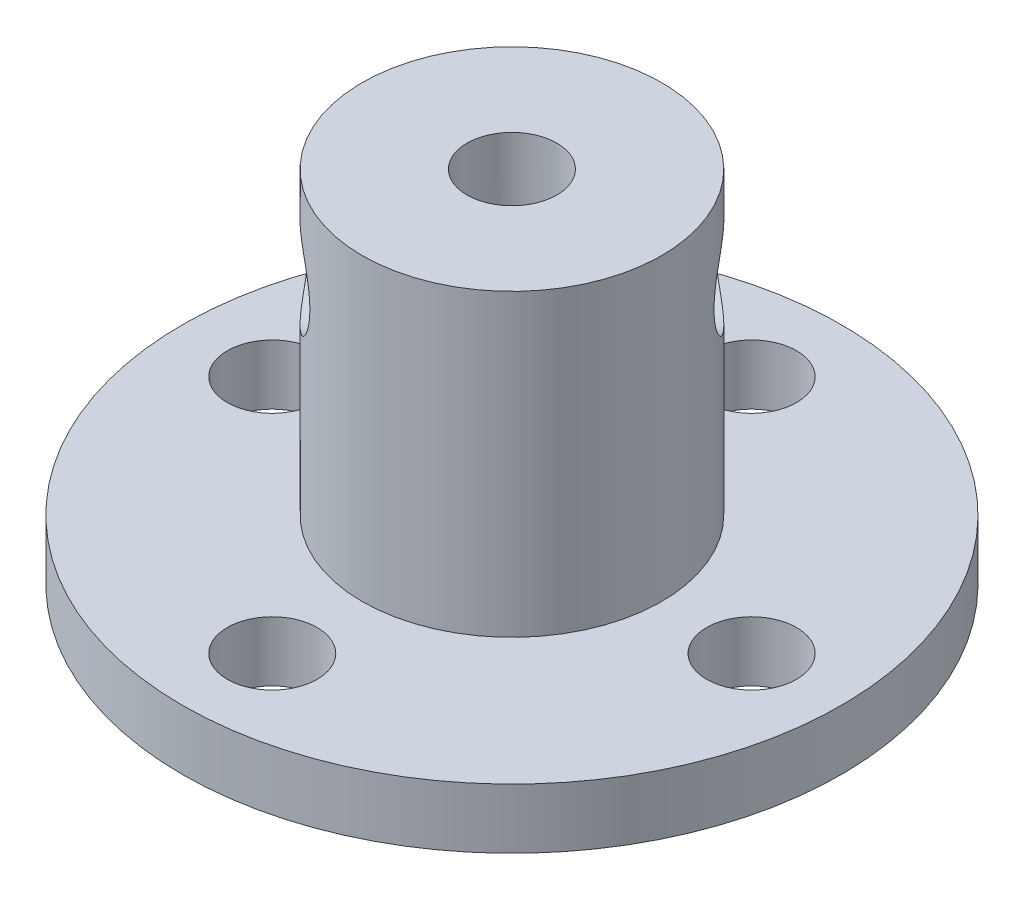
ISO-10303-21;
HEADER;
FILE_DESCRIPTION(('STEP AP214'),'2;1');
FILE_NAME('part.step','',(''),(''),'','','');
FILE_SCHEMA(('AUTOMOTIVE_DESIGN { 1 0 10303 214 1 1 1 1 }'));
ENDSEC;
DATA;
#1=APPLICATION_CONTEXT('core data for automotive mechanical design processes');
#2=APPLICATION_PROTOCOL_DEFINITION('international standard','automotive_design',2000,#1);
#3=PRODUCT_CONTEXT('',#1,'mechanical');
#4=PRODUCT('Part','Part','',(#3));
#5=PRODUCT_RELATED_PRODUCT_CATEGORY('part','',(#4));
#6=PRODUCT_DEFINITION_FORMATION('','',#4);
#7=PRODUCT_DEFINITION_CONTEXT('part definition',#1,'design');
#8=PRODUCT_DEFINITION('design','',#6,#7);
#9=PRODUCT_DEFINITION_SHAPE('','',#8);
#10=(LENGTH_UNIT() NAMED_UNIT(*) SI_UNIT(.MILLI.,.METRE.));
#11=(NAMED_UNIT(*) PLANE_ANGLE_UNIT() SI_UNIT($,.RADIAN.));
#12=(NAMED_UNIT(*) SI_UNIT($,.STERADIAN.) SOLID_ANGLE_UNIT());
#13=UNCERTAINTY_MEASURE_WITH_UNIT(LENGTH_MEASURE(1.E-05),#10,'distance_accuracy_value','');
#14=(GEOMETRIC_REPRESENTATION_CONTEXT(3) GLOBAL_UNCERTAINTY_ASSIGNED_CONTEXT((#13)) GLOBAL_UNIT_ASSIGNED_CONTEXT((#10,
#11,#12)) REPRESENTATION_CONTEXT('',''));
#15=CARTESIAN_POINT('',(0.,0.,0.));
#16=DIRECTION('',(0.,0.,1.));
#17=DIRECTION('',(1.,0.,0.));
#18=AXIS2_PLACEMENT_3D('',#15,#16,#17);
#19=CARTESIAN_POINT('',(0.,0.,0.));
#20=DIRECTION('',(0.,1.,0.));
#21=DIRECTION('',(0.,0.,1.));
#22=AXIS2_PLACEMENT_3D('',#19,#20,#21);
#23=CYLINDRICAL_SURFACE('',#22,1.5);
#24=CARTESIAN_POINT('',(0.,12.,0.));
#25=DIRECTION('',(0.,1.,0.));
#26=DIRECTION('',(0.,0.,1.));
#27=AXIS2_PLACEMENT_3D('',#24,#25,#26);
#28=CIRCLE('',#27,1.5);
#29=CARTESIAN_POINT('',(0.,12.,1.5));
#30=VERTEX_POINT('',#29);
#31=EDGE_CURVE('E108',#30,#30,#28,.T.);
#32=ORIENTED_EDGE('',*,*,#31,.T.);
#33=EDGE_LOOP('',(#32));
#34=FACE_BOUND('',#33,.T.);
#35=CARTESIAN_POINT('',(0.,9.,0.));
#36=DIRECTION('',(-0.5,0.707106781186547,0.5));
#37=DIRECTION('',(0.5,0.707106781186547,-0.5));
#38=AXIS2_PLACEMENT_3D('',#35,#36,#37);
#39=ELLIPSE('',#38,2.12132034355964,1.5);
#40=CARTESIAN_POINT('',(-1.06066017177982,9.,-1.06066017177982));
#41=VERTEX_POINT('',#40);
#42=CARTESIAN_POINT('',(1.06066017177982,9.,1.06066017177982));
#43=VERTEX_POINT('',#42);
#44=EDGE_CURVE('E52',#41,#43,#39,.F.);
#45=ORIENTED_EDGE('',*,*,#44,.T.);
#46=CARTESIAN_POINT('',(0.,9.,0.));
#47=DIRECTION('',(0.5,0.707106781186547,-0.5));
#48=DIRECTION('',(-0.5,0.707106781186547,0.5));
#49=AXIS2_PLACEMENT_3D('',#46,#47,#48);
#50=ELLIPSE('',#49,2.12132034355964,1.5);
#51=EDGE_CURVE('E11',#43,#41,#50,.F.);
#52=ORIENTED_EDGE('',*,*,#51,.T.);
#53=EDGE_LOOP('',(#45,#52));
#54=FACE_BOUND('',#53,.T.);
#55=ADVANCED_FACE('F39',(#34,#54),#23,.F.);
#56=CARTESIAN_POINT('',(0.,2.,0.));
#57=DIRECTION('',(0.,1.,0.));
#58=DIRECTION('',(0.,0.,1.));
#59=AXIS2_PLACEMENT_3D('',#56,#57,#58);
#60=PLANE('',#59);
#61=CARTESIAN_POINT('',(0.,2.,0.));
#62=DIRECTION('',(0.,1.,0.));
#63=DIRECTION('',(0.,0.,1.));
#64=AXIS2_PLACEMENT_3D('',#61,#62,#63);
#65=CIRCLE('',#64,5.);
#66=CARTESIAN_POINT('',(0.,2.,5.));
#67=VERTEX_POINT('',#66);
#68=EDGE_CURVE('E102',#67,#67,#65,.T.);
#69=ORIENTED_EDGE('',*,*,#68,.F.);
#70=EDGE_LOOP('',(#69));
#71=FACE_BOUND('',#70,.T.);
#72=CARTESIAN_POINT('',(0.,2.,8.));
#73=DIRECTION('',(0.,1.,0.));
#74=DIRECTION('',(0.,0.,1.));
#75=AXIS2_PLACEMENT_3D('',#72,#73,#74);
#76=CIRCLE('',#75,1.5);
#77=CARTESIAN_POINT('',(0.,2.,9.5));
#78=VERTEX_POINT('',#77);
#79=EDGE_CURVE('E87',#78,#78,#76,.T.);
#80=ORIENTED_EDGE('',*,*,#79,.F.);
#81=EDGE_LOOP('',(#80));
#82=FACE_BOUND('',#81,.T.);
#83=CARTESIAN_POINT('',(0.,2.,-8.));
#84=DIRECTION('',(0.,1.,0.));
#85=DIRECTION('',(0.,0.,1.));
#86=AXIS2_PLACEMENT_3D('',#83,#84,#85);
#87=CIRCLE('',#86,1.5);
#88=CARTESIAN_POINT('',(0.,2.,-6.5));
#89=VERTEX_POINT('',#88);
#90=EDGE_CURVE('E75',#89,#89,#87,.T.);
#91=ORIENTED_EDGE('',*,*,#90,.F.);
#92=EDGE_LOOP('',(#91));
#93=FACE_BOUND('',#92,.T.);
#94=CARTESIAN_POINT('',(0.,2.,0.));
#95=DIRECTION('',(0.,1.,0.));
#96=DIRECTION('',(0.,0.,1.));
#97=AXIS2_PLACEMENT_3D('',#94,#95,#96);
#98=CIRCLE('',#97,11.);
#99=CARTESIAN_POINT('',(0.,2.,11.));
#100=VERTEX_POINT('',#99);
#101=EDGE_CURVE('E67',#100,#100,#98,.T.);
#102=ORIENTED_EDGE('',*,*,#101,.T.);
#103=EDGE_LOOP('',(#102));
#104=FACE_BOUND('',#103,.T.);
#105=CARTESIAN_POINT('',(8.,2.,0.));
#106=DIRECTION('',(0.,1.,0.));
#107=DIRECTION('',(0.,0.,1.));
#108=AXIS2_PLACEMENT_3D('',#105,#106,#107);
#109=CIRCLE('',#108,1.5);
#110=CARTESIAN_POINT('',(8.,2.,1.50000000000003));
#111=VERTEX_POINT('',#110);
#112=EDGE_CURVE('E81',#111,#111,#109,.T.);
#113=ORIENTED_EDGE('',*,*,#112,.F.);
#114=EDGE_LOOP('',(#113));
#115=FACE_BOUND('',#114,.T.);
#116=CARTESIAN_POINT('',(-8.,2.,0.));
#117=DIRECTION('',(0.,1.,0.));
#118=DIRECTION('',(0.,0.,1.));
#119=AXIS2_PLACEMENT_3D('',#116,#117,#118);
#120=CIRCLE('',#119,1.5);
#121=CARTESIAN_POINT('',(-8.,2.,1.49999999999992));
#122=VERTEX_POINT('',#121);
#123=EDGE_CURVE('E93',#122,#122,#120,.T.);
#124=ORIENTED_EDGE('',*,*,#123,.F.);
#125=EDGE_LOOP('',(#124));
#126=FACE_BOUND('',#125,.T.);
#127=ADVANCED_FACE('F146',(#71,#82,#93,#104,#115,#126),#60,.T.);
#128=CARTESIAN_POINT('',(0.,0.,0.));
#129=DIRECTION('',(0.,1.,0.));
#130=DIRECTION('',(0.,0.,1.));
#131=AXIS2_PLACEMENT_3D('',#128,#129,#130);
#132=PLANE('',#131);
#133=CARTESIAN_POINT('',(0.,0.,0.));
#134=DIRECTION('',(0.,1.,0.));
#135=DIRECTION('',(0.,0.,1.));
#136=AXIS2_PLACEMENT_3D('',#133,#134,#135);
#137=CIRCLE('',#136,1.5);
#138=CARTESIAN_POINT('',(0.,0.,1.5));
#139=VERTEX_POINT('',#138);
#140=EDGE_CURVE('E105',#139,#139,#137,.T.);
#141=ORIENTED_EDGE('',*,*,#140,.T.);
#142=EDGE_LOOP('',(#141));
#143=FACE_BOUND('',#142,.T.);
#144=CARTESIAN_POINT('',(0.,0.,0.));
#145=DIRECTION('',(0.,1.,0.));
#146=DIRECTION('',(0.,0.,1.));
#147=AXIS2_PLACEMENT_3D('',#144,#145,#146);
#148=CIRCLE('',#147,11.);
#149=CARTESIAN_POINT('',(0.,0.,11.));
#150=VERTEX_POINT('',#149);
#151=EDGE_CURVE('E72',#150,#150,#148,.T.);
#152=ORIENTED_EDGE('',*,*,#151,.F.);
#153=EDGE_LOOP('',(#152));
#154=FACE_BOUND('',#153,.T.);
#155=CARTESIAN_POINT('',(0.,0.,-8.));
#156=DIRECTION('',(0.,1.,0.));
#157=DIRECTION('',(0.,0.,1.));
#158=AXIS2_PLACEMENT_3D('',#155,#156,#157);
#159=CIRCLE('',#158,1.5);
#160=CARTESIAN_POINT('',(0.,0.,-6.5));
#161=VERTEX_POINT('',#160);
#162=EDGE_CURVE('E78',#161,#161,#159,.T.);
#163=ORIENTED_EDGE('',*,*,#162,.T.);
#164=EDGE_LOOP('',(#163));
#165=FACE_BOUND('',#164,.T.);
#166=CARTESIAN_POINT('',(8.,0.,0.));
#167=DIRECTION('',(0.,1.,0.));
#168=DIRECTION('',(0.,0.,1.));
#169=AXIS2_PLACEMENT_3D('',#166,#167,#168);
#170=CIRCLE('',#169,1.5);
#171=CARTESIAN_POINT('',(8.,0.,1.50000000000003));
#172=VERTEX_POINT('',#171);
#173=EDGE_CURVE('E84',#172,#172,#170,.T.);
#174=ORIENTED_EDGE('',*,*,#173,.T.);
#175=EDGE_LOOP('',(#174));
#176=FACE_BOUND('',#175,.T.);
#177=CARTESIAN_POINT('',(0.,0.,8.));
#178=DIRECTION('',(0.,1.,0.));
#179=DIRECTION('',(0.,0.,1.));
#180=AXIS2_PLACEMENT_3D('',#177,#178,#179);
#181=CIRCLE('',#180,1.5);
#182=CARTESIAN_POINT('',(0.,0.,9.5));
#183=VERTEX_POINT('',#182);
#184=EDGE_CURVE('E90',#183,#183,#181,.T.);
#185=ORIENTED_EDGE('',*,*,#184,.T.);
#186=EDGE_LOOP('',(#185));
#187=FACE_BOUND('',#186,.T.);
#188=CARTESIAN_POINT('',(-8.,0.,0.));
#189=DIRECTION('',(0.,1.,0.));
#190=DIRECTION('',(0.,0.,1.));
#191=AXIS2_PLACEMENT_3D('',#188,#189,#190);
#192=CIRCLE('',#191,1.5);
#193=CARTESIAN_POINT('',(-8.,0.,1.49999999999992));
#194=VERTEX_POINT('',#193);
#195=EDGE_CURVE('E96',#194,#194,#192,.T.);
#196=ORIENTED_EDGE('',*,*,#195,.T.);
#197=EDGE_LOOP('',(#196));
#198=FACE_BOUND('',#197,.T.);
#199=ADVANCED_FACE('F151',(#143,#154,#165,#176,#187,#198),#132,.F.);
#200=CARTESIAN_POINT('',(0.,2.,0.));
#201=DIRECTION('',(0.,-1.,0.));
#202=DIRECTION('',(0.,0.,-1.));
#203=AXIS2_PLACEMENT_3D('',#200,#201,#202);
#204=CYLINDRICAL_SURFACE('',#203,11.);
#205=ORIENTED_EDGE('',*,*,#101,.F.);
#206=EDGE_LOOP('',(#205));
#207=FACE_BOUND('',#206,.T.);
#208=ORIENTED_EDGE('',*,*,#151,.T.);
#209=EDGE_LOOP('',(#208));
#210=FACE_BOUND('',#209,.T.);
#211=ADVANCED_FACE('F41',(#207,#210),#204,.T.);
#212=CARTESIAN_POINT('',(0.,2.,-8.));
#213=DIRECTION('',(0.,-1.,0.));
#214=DIRECTION('',(0.,0.,-1.));
#215=AXIS2_PLACEMENT_3D('',#212,#213,#214);
#216=CYLINDRICAL_SURFACE('',#215,1.5);
#217=ORIENTED_EDGE('',*,*,#90,.T.);
#218=EDGE_LOOP('',(#217));
#219=FACE_BOUND('',#218,.T.);
#220=ORIENTED_EDGE('',*,*,#162,.F.);
#221=EDGE_LOOP('',(#220));
#222=FACE_BOUND('',#221,.T.);
#223=ADVANCED_FACE('F161',(#219,#222),#216,.F.);
#224=CARTESIAN_POINT('',(8.,2.,0.));
#225=DIRECTION('',(0.,-1.,0.));
#226=DIRECTION('',(0.,0.,-1.));
#227=AXIS2_PLACEMENT_3D('',#224,#225,#226);
#228=CYLINDRICAL_SURFACE('',#227,1.5);
#229=ORIENTED_EDGE('',*,*,#112,.T.);
#230=EDGE_LOOP('',(#229));
#231=FACE_BOUND('',#230,.T.);
#232=ORIENTED_EDGE('',*,*,#173,.F.);
#233=EDGE_LOOP('',(#232));
#234=FACE_BOUND('',#233,.T.);
#235=ADVANCED_FACE('F164',(#231,#234),#228,.F.);
#236=CARTESIAN_POINT('',(0.,2.,8.));
#237=DIRECTION('',(0.,-1.,0.));
#238=DIRECTION('',(0.,0.,-1.));
#239=AXIS2_PLACEMENT_3D('',#236,#237,#238);
#240=CYLINDRICAL_SURFACE('',#239,1.5);
#241=ORIENTED_EDGE('',*,*,#79,.T.);
#242=EDGE_LOOP('',(#241));
#243=FACE_BOUND('',#242,.T.);
#244=ORIENTED_EDGE('',*,*,#184,.F.);
#245=EDGE_LOOP('',(#244));
#246=FACE_BOUND('',#245,.T.);
#247=ADVANCED_FACE('F168',(#243,#246),#240,.F.);
#248=CARTESIAN_POINT('',(-8.,2.,0.));
#249=DIRECTION('',(0.,-1.,0.));
#250=DIRECTION('',(0.,0.,-1.));
#251=AXIS2_PLACEMENT_3D('',#248,#249,#250);
#252=CYLINDRICAL_SURFACE('',#251,1.5);
#253=ORIENTED_EDGE('',*,*,#123,.T.);
#254=EDGE_LOOP('',(#253));
#255=FACE_BOUND('',#254,.T.);
#256=ORIENTED_EDGE('',*,*,#195,.F.);
#257=EDGE_LOOP('',(#256));
#258=FACE_BOUND('',#257,.T.);
#259=ADVANCED_FACE('F142',(#255,#258),#252,.F.);
#260=CARTESIAN_POINT('',(0.,12.,0.));
#261=DIRECTION('',(0.,-1.,0.));
#262=DIRECTION('',(0.,0.,-1.));
#263=AXIS2_PLACEMENT_3D('',#260,#261,#262);
#264=CYLINDRICAL_SURFACE('',#263,5.);
#265=CARTESIAN_POINT('',(-4.43334456258783,9.,2.31202421902819));
#266=CARTESIAN_POINT('',(-4.43334443992087,9.08219454794241,2.31202554403842));
#267=CARTESIAN_POINT('',(-4.43006993459258,9.16439922414403,2.31833642927143));
#268=CARTESIAN_POINT('',(-4.41695964010883,9.32640524959194,2.34321564064259));
#269=CARTESIAN_POINT('',(-4.40712165863545,9.40620578650146,2.36178806233066));
#270=CARTESIAN_POINT('',(-4.38087197181142,9.56103472827173,2.4101264355274));
#271=CARTESIAN_POINT('',(-4.36447119812474,9.63607082963309,2.43987376793349));
#272=CARTESIAN_POINT('',(-4.32504234678051,9.7796219339953,2.50910131305914));
#273=CARTESIAN_POINT('',(-4.3020132769563,9.84813595868444,2.54858298275095));
#274=CARTESIAN_POINT('',(-4.24852110256373,9.97886639057737,2.63681609316769));
#275=CARTESIAN_POINT('',(-4.21786377501926,10.0408458979463,2.68580086658526));
#276=CARTESIAN_POINT('',(-4.14950401628167,10.1546379513225,2.79025211380835));
#277=CARTESIAN_POINT('',(-4.11180068071223,10.2064491904499,2.84571941932361));
#278=CARTESIAN_POINT('',(-4.02870099338256,10.2994626998333,2.96222637051405));
#279=CARTESIAN_POINT('',(-3.98316167701534,10.3404234244428,3.02335752947632));
#280=CARTESIAN_POINT('',(-3.88552984554572,10.4089872590428,3.14784119759632));
#281=CARTESIAN_POINT('',(-3.83343874682248,10.4365932498574,3.21119322451312));
#282=CARTESIAN_POINT('',(-3.72532158709197,10.4768800010905,3.33595486065663));
#283=CARTESIAN_POINT('',(-3.66945071855995,10.4899651276527,3.39736819287555));
#284=CARTESIAN_POINT('',(-3.55395675199785,10.5021173246464,3.51800486407131));
#285=CARTESIAN_POINT('',(-3.49433444469875,10.501187339402,3.57722866040972));
#286=CARTESIAN_POINT('',(-3.37510897121293,10.485607131457,3.68987211946994));
#287=CARTESIAN_POINT('',(-3.31556566784942,10.4713948061901,3.74341656065754));
#288=CARTESIAN_POINT('',(-3.1965653052412,10.4303686640057,3.84553265451835));
#289=CARTESIAN_POINT('',(-3.1371082516974,10.4035540490573,3.89410399203613));
#290=CARTESIAN_POINT('',(-3.01956154086986,10.3377879765814,3.98596059760723));
#291=CARTESIAN_POINT('',(-2.96149587552015,10.2986987971927,4.02917770912896));
#292=CARTESIAN_POINT('',(-2.84945063455304,10.2096021475718,4.10918211710003));
#293=CARTESIAN_POINT('',(-2.79547203243598,10.1595920870365,4.14596788437747));
#294=CARTESIAN_POINT('',(-2.6915701592937,10.0478022492484,4.21419801434429));
#295=CARTESIAN_POINT('',(-2.64188342709997,9.98564308097026,4.24538181032646));
#296=CARTESIAN_POINT('',(-2.55107388266224,9.85248998210995,4.30056426843168));
#297=CARTESIAN_POINT('',(-2.50995192153674,9.78149517461077,4.32456221656942));
#298=CARTESIAN_POINT('',(-2.43784897157755,9.63176053075101,4.36561998102411));
#299=CARTESIAN_POINT('',(-2.40696900747494,9.55295295413708,4.38261105977234));
#300=CARTESIAN_POINT('',(-2.35758614215625,9.39039279155446,4.40937473672974));
#301=CARTESIAN_POINT('',(-2.33907920328655,9.30664182846544,4.41914968986497));
#302=CARTESIAN_POINT('',(-2.3159874008666,9.13991763926072,4.43129408808538));
#303=CARTESIAN_POINT('',(-2.31090933495099,9.05703177610602,4.43392597648717));
#304=CARTESIAN_POINT('',(-2.31354905591369,8.89152709999014,4.43254934299385));
#305=CARTESIAN_POINT('',(-2.32126505161215,8.80890825126915,4.42854175063195));
#306=CARTESIAN_POINT('',(-2.34866786614152,8.64851162202913,4.41406686187907));
#307=CARTESIAN_POINT('',(-2.3680384914019,8.57066383573648,4.40377008472265));
#308=CARTESIAN_POINT('',(-2.4174606479491,8.41959830918508,4.3768334249355));
#309=CARTESIAN_POINT('',(-2.44751382836052,8.34638128585943,4.36019256290484));
#310=CARTESIAN_POINT('',(-2.51782314425725,8.20448253592787,4.31998194950397));
#311=CARTESIAN_POINT('',(-2.55833147498567,8.13597527901421,4.29623821612196));
#312=CARTESIAN_POINT('',(-2.64735761279477,8.0073618938192,4.2419583803221));
#313=CARTESIAN_POINT('',(-2.69587733662622,7.94725778238721,4.21142065181082));
#314=CARTESIAN_POINT('',(-2.80097809014149,7.83481959418526,4.14229620181631));
#315=CARTESIAN_POINT('',(-2.85779424855097,7.78286437101302,4.10344920377485));
#316=CARTESIAN_POINT('',(-2.97577879668644,7.69103329897225,4.01870725418584));
#317=CARTESIAN_POINT('',(-3.03694697008581,7.65115685021854,3.97281265282398));
#318=CARTESIAN_POINT('',(-3.16085513459745,7.58499996943171,3.87494177347528));
#319=CARTESIAN_POINT('',(-3.22357954520105,7.55861798384103,3.82301464229711));
#320=CARTESIAN_POINT('',(-3.34875152909492,7.51993908110958,3.71385899712312));
#321=CARTESIAN_POINT('',(-3.4111991764942,7.50763813405158,3.65663200498942));
#322=CARTESIAN_POINT('',(-3.53130066052481,7.4977769559455,3.54070822676477));
#323=CARTESIAN_POINT('',(-3.58904649569495,7.49966730459217,3.48215291031684));
#324=CARTESIAN_POINT('',(-3.70063777145002,7.51682163249912,3.36332028629713));
#325=CARTESIAN_POINT('',(-3.7544834329982,7.53208485348044,3.30304307654896));
#326=CARTESIAN_POINT('',(-3.85645254842055,7.57521166139963,3.18337766679839));
#327=CARTESIAN_POINT('',(-3.90463124048534,7.60293818064901,3.1239868710096));
#328=CARTESIAN_POINT('',(-3.99512691609726,7.67008191450719,3.00739315885616));
#329=CARTESIAN_POINT('',(-4.03744293469284,7.70950105028619,2.95019060377826));
#330=CARTESIAN_POINT('',(-4.11701719288618,7.80037345743004,2.83814119214537));
#331=CARTESIAN_POINT('',(-4.15407027313071,7.85217143000077,2.78342827695238));
#332=CARTESIAN_POINT('',(-4.22126693047111,7.9657103883328,2.68042812035863));
#333=CARTESIAN_POINT('',(-4.25140851140172,8.02745423789815,2.63214273702943));
#334=CARTESIAN_POINT('',(-4.30555162407097,8.16134077831051,2.54264575594493));
#335=CARTESIAN_POINT('',(-4.32934338024624,8.23373855339044,2.50168788044894));
#336=CARTESIAN_POINT('',(-4.36961486920418,8.38555517416102,2.4306670726817));
#337=CARTESIAN_POINT('',(-4.38609811599728,8.4649706236012,2.40059890579738));
#338=CARTESIAN_POINT('',(-4.41043542393912,8.61974043160628,2.35555564624659));
#339=CARTESIAN_POINT('',(-4.41902857163294,8.69460864693099,2.33930224282498));
#340=CARTESIAN_POINT('',(-4.43048262371996,8.84631522249577,2.31753698650753));
#341=CARTESIAN_POINT('',(-4.43334467727386,8.92315318464525,2.31202298022564));
#342=CARTESIAN_POINT('',(-4.43334456258783,9.,2.31202421902819));
#343=B_SPLINE_CURVE_WITH_KNOTS('',3,(#265,#266,#267,#268,#269,#270,#271,#272,#273,#274,#275,
#276,#277,#278,#279,#280,#281,#282,#283,#284,#285,#286,#287,#288,#289,#290,#291,#292,#293,#294,
#295,#296,#297,#298,#299,#300,#301,#302,#303,#304,#305,#306,#307,#308,#309,#310,#311,#312,#313,
#314,#315,#316,#317,#318,#319,#320,#321,#322,#323,#324,#325,#326,#327,#328,#329,#330,#331,#332,
#333,#334,#335,#336,#337,#338,#339,#340,#341,#342),.UNSPECIFIED.,.T.,.F.,(4,2,2,2,2,2,2,2,2,2,2,
2,2,2,2,2,2,2,2,2,2,2,2,2,2,2,2,2,2,2,2,2,2,2,2,2,2,2,4),(0.,0.246300165915542,
0.492682641688999,0.738656414466191,0.984667025370098,1.23773150007984,1.49082847871273,
1.74915939273644,2.00743455587877,2.25832140149557,2.5091555410144,2.7520012599088,
2.99486235890376,3.24055209335676,3.4863001659083,3.74152147023278,3.99676812491863,
4.25446238246266,4.51207250628411,4.76008080790309,5.00805439107387,5.24958594938817,
5.49115481045787,5.73920731809388,5.98731925928923,6.24479506100602,6.50225807324202,
6.75775391814325,7.01317662321682,7.2587630391122,7.50433553047754,7.74727096872219,
7.99024634491378,8.24099627054488,8.4918185262989,8.75011639669147,9.00828993963944,
9.23861153857447,9.4688869503356),.UNSPECIFIED.);
#344=CARTESIAN_POINT('',(-4.43334456258783,9.,2.31202421902819));
#345=VERTEX_POINT('',#344);
#346=EDGE_CURVE('E111',#345,#345,#343,.T.);
#347=ORIENTED_EDGE('',*,*,#346,.T.);
#348=EDGE_LOOP('',(#347));
#349=FACE_BOUND('',#348,.T.);
#350=CARTESIAN_POINT('',(2.31202421902819,9.,-4.43334456258783));
#351=CARTESIAN_POINT('',(2.31202554403841,8.9178054520576,-4.43334443992086));
#352=CARTESIAN_POINT('',(2.31833642927143,8.83560077585598,-4.43006993459257));
#353=CARTESIAN_POINT('',(2.34321564064259,8.67359475040806,-4.41695964010883));
#354=CARTESIAN_POINT('',(2.36178806233066,8.59379421349854,-4.40712165863545));
#355=CARTESIAN_POINT('',(2.4101264355274,8.43896527172827,-4.38087197181142));
#356=CARTESIAN_POINT('',(2.43987376793349,8.36392917036692,-4.36447119812474));
#357=CARTESIAN_POINT('',(2.50910131305914,8.2203780660047,-4.32504234678051));
#358=CARTESIAN_POINT('',(2.54858298275095,8.15186404131556,-4.3020132769563));
#359=CARTESIAN_POINT('',(2.63681609316769,8.02113360942263,-4.24852110256373));
#360=CARTESIAN_POINT('',(2.68580086658526,7.95915410205372,-4.21786377501926));
#361=CARTESIAN_POINT('',(2.79025211380835,7.84536204867749,-4.14950401628167));
#362=CARTESIAN_POINT('',(2.84571941932361,7.79355080955012,-4.11180068071223));
#363=CARTESIAN_POINT('',(2.96222637051405,7.70053730016669,-4.02870099338256));
#364=CARTESIAN_POINT('',(3.02335752947632,7.65957657555719,-3.98316167701534));
#365=CARTESIAN_POINT('',(3.14784119759632,7.59101274095725,-3.88552984554572));
#366=CARTESIAN_POINT('',(3.21119322451312,7.56340675014255,-3.83343874682248));
#367=CARTESIAN_POINT('',(3.33595486065664,7.52311999890949,-3.72532158709197));
#368=CARTESIAN_POINT('',(3.39736819287555,7.5100348723473,-3.66945071855995));
#369=CARTESIAN_POINT('',(3.51800486407131,7.49788267535356,-3.55395675199785));
#370=CARTESIAN_POINT('',(3.57722866040971,7.49881266059804,-3.49433444469875));
#371=CARTESIAN_POINT('',(3.68987211946994,7.51439286854303,-3.37510897121293));
#372=CARTESIAN_POINT('',(3.74341656065754,7.52860519380987,-3.31556566784942));
#373=CARTESIAN_POINT('',(3.84553265451835,7.56963133599429,-3.1965653052412));
#374=CARTESIAN_POINT('',(3.89410399203613,7.59644595094267,-3.1371082516974));
#375=CARTESIAN_POINT('',(3.98596059760723,7.66221202341856,-3.01956154086986));
#376=CARTESIAN_POINT('',(4.02917770912896,7.70130120280727,-2.96149587552015));
#377=CARTESIAN_POINT('',(4.10918211710003,7.79039785242823,-2.84945063455304));
#378=CARTESIAN_POINT('',(4.14596788437747,7.84040791296349,-2.79547203243598));
#379=CARTESIAN_POINT('',(4.21419801434429,7.9521977507516,-2.6915701592937));
#380=CARTESIAN_POINT('',(4.24538181032646,8.01435691902974,-2.64188342709997));
#381=CARTESIAN_POINT('',(4.30056426843168,8.14751001789005,-2.55107388266224));
#382=CARTESIAN_POINT('',(4.32456221656942,8.21850482538923,-2.50995192153674));
#383=CARTESIAN_POINT('',(4.36561998102412,8.36823946924899,-2.43784897157755));
#384=CARTESIAN_POINT('',(4.38261105977233,8.44704704586292,-2.40696900747494));
#385=CARTESIAN_POINT('',(4.40937473672974,8.60960720844554,-2.35758614215625));
#386=CARTESIAN_POINT('',(4.41914968986497,8.69335817153456,-2.33907920328655));
#387=CARTESIAN_POINT('',(4.43129408808538,8.86008236073928,-2.3159874008666));
#388=CARTESIAN_POINT('',(4.43392597648717,8.94296822389398,-2.310909334951));
#389=CARTESIAN_POINT('',(4.43254934299385,9.10847290000987,-2.3135490559137));
#390=CARTESIAN_POINT('',(4.42854175063195,9.19109174873085,-2.32126505161215));
#391=CARTESIAN_POINT('',(4.41406686187907,9.35148837797087,-2.34866786614152));
#392=CARTESIAN_POINT('',(4.40377008472265,9.42933616426352,-2.3680384914019));
#393=CARTESIAN_POINT('',(4.3768334249355,9.58040169081492,-2.4174606479491));
#394=CARTESIAN_POINT('',(4.36019256290484,9.65361871414057,-2.44751382836052));
#395=CARTESIAN_POINT('',(4.31998194950397,9.79551746407213,-2.51782314425725));
#396=CARTESIAN_POINT('',(4.29623821612196,9.86402472098579,-2.55833147498567));
#397=CARTESIAN_POINT('',(4.2419583803221,9.9926381061808,-2.64735761279477));
#398=CARTESIAN_POINT('',(4.21142065181082,10.0527422176128,-2.69587733662622));
#399=CARTESIAN_POINT('',(4.14229620181631,10.1651804058147,-2.80097809014149));
#400=CARTESIAN_POINT('',(4.10344920377485,10.217135628987,-2.85779424855097));
#401=CARTESIAN_POINT('',(4.01870725418584,10.3089667010278,-2.97577879668644));
#402=CARTESIAN_POINT('',(3.97281265282399,10.3488431497815,-3.03694697008581));
#403=CARTESIAN_POINT('',(3.87494177347528,10.4150000305683,-3.16085513459745));
#404=CARTESIAN_POINT('',(3.82301464229711,10.441382016159,-3.22357954520105));
#405=CARTESIAN_POINT('',(3.71385899712312,10.4800609188904,-3.34875152909492));
#406=CARTESIAN_POINT('',(3.65663200498942,10.4923618659484,-3.4111991764942));
#407=CARTESIAN_POINT('',(3.54070822676477,10.5022230440545,-3.5313006605248));
#408=CARTESIAN_POINT('',(3.48215291031684,10.5003326954078,-3.58904649569495));
#409=CARTESIAN_POINT('',(3.36332028629713,10.4831783675009,-3.70063777145002));
#410=CARTESIAN_POINT('',(3.30304307654896,10.4679151465196,-3.7544834329982));
#411=CARTESIAN_POINT('',(3.18337766679839,10.4247883386004,-3.85645254842055));
#412=CARTESIAN_POINT('',(3.1239868710096,10.397061819351,-3.90463124048534));
#413=CARTESIAN_POINT('',(3.00739315885616,10.3299180854928,-3.99512691609726));
#414=CARTESIAN_POINT('',(2.95019060377826,10.2904989497138,-4.03744293469284));
#415=CARTESIAN_POINT('',(2.83814119214537,10.19962654257,-4.11701719288618));
#416=CARTESIAN_POINT('',(2.78342827695238,10.1478285699992,-4.15407027313071));
#417=CARTESIAN_POINT('',(2.68042812035863,10.0342896116672,-4.2212669304711));
#418=CARTESIAN_POINT('',(2.63214273702943,9.97254576210185,-4.25140851140172));
#419=CARTESIAN_POINT('',(2.54264575594493,9.8386592216895,-4.30555162407097));
#420=CARTESIAN_POINT('',(2.50168788044894,9.76626144660957,-4.32934338024624));
#421=CARTESIAN_POINT('',(2.4306670726817,9.61444482583898,-4.36961486920418));
#422=CARTESIAN_POINT('',(2.40059890579738,9.53502937639881,-4.38609811599728));
#423=CARTESIAN_POINT('',(2.35555564624659,9.38025956839373,-4.41043542393912));
#424=CARTESIAN_POINT('',(2.33930224282498,9.30539135306901,-4.41902857163294));
#425=CARTESIAN_POINT('',(2.31753698650753,9.15368477750423,-4.43048262371996));
#426=CARTESIAN_POINT('',(2.31202298022563,9.07684681535475,-4.43334467727385));
#427=CARTESIAN_POINT('',(2.31202421902819,9.,-4.43334456258783));
#428=B_SPLINE_CURVE_WITH_KNOTS('',3,(#350,#351,#352,#353,#354,#355,#356,#357,#358,#359,#360,
#361,#362,#363,#364,#365,#366,#367,#368,#369,#370,#371,#372,#373,#374,#375,#376,#377,#378,#379,
#380,#381,#382,#383,#384,#385,#386,#387,#388,#389,#390,#391,#392,#393,#394,#395,#396,#397,#398,
#399,#400,#401,#402,#403,#404,#405,#406,#407,#408,#409,#410,#411,#412,#413,#414,#415,#416,#417,
#418,#419,#420,#421,#422,#423,#424,#425,#426,#427),.UNSPECIFIED.,.T.,.F.,(4,2,2,2,2,2,2,2,2,2,2,
2,2,2,2,2,2,2,2,2,2,2,2,2,2,2,2,2,2,2,2,2,2,2,2,2,2,2,4),(0.,0.246300165915544,
0.492682641688999,0.738656414466193,0.984667025370101,1.23773150007984,1.49082847871273,
1.74915939273644,2.00743455587877,2.25832140149557,2.5091555410144,2.7520012599088,
2.99486235890376,3.24055209335676,3.4863001659083,3.74152147023278,3.99676812491863,
4.25446238246266,4.51207250628411,4.76008080790309,5.00805439107387,5.24958594938816,
5.49115481045787,5.73920731809388,5.98731925928922,6.24479506100602,6.50225807324202,
6.75775391814325,7.01317662321682,7.2587630391122,7.50433553047754,7.74727096872218,
7.99024634491378,8.24099627054487,8.4918185262989,8.75011639669147,9.00828993963944,
9.23861153857447,9.4688869503356),.UNSPECIFIED.);
#429=CARTESIAN_POINT('',(2.31202421902819,9.,-4.43334456258783));
#430=VERTEX_POINT('',#429);
#431=EDGE_CURVE('E121',#430,#430,#428,.T.);
#432=ORIENTED_EDGE('',*,*,#431,.T.);
#433=EDGE_LOOP('',(#432));
#434=FACE_BOUND('',#433,.T.);
#435=CARTESIAN_POINT('',(0.,12.,0.));
#436=DIRECTION('',(0.,1.,0.));
#437=DIRECTION('',(0.,0.,1.));
#438=AXIS2_PLACEMENT_3D('',#435,#436,#437);
#439=CIRCLE('',#438,5.);
#440=CARTESIAN_POINT('',(0.,12.,5.));
#441=VERTEX_POINT('',#440);
#442=EDGE_CURVE('E99',#441,#441,#439,.T.);
#443=ORIENTED_EDGE('',*,*,#442,.F.);
#444=EDGE_LOOP('',(#443));
#445=FACE_BOUND('',#444,.T.);
#446=ORIENTED_EDGE('',*,*,#68,.T.);
#447=EDGE_LOOP('',(#446));
#448=FACE_BOUND('',#447,.T.);
#449=ADVANCED_FACE('F125',(#349,#434,#445,#448),#264,.T.);
#450=CARTESIAN_POINT('',(0.,12.,0.));
#451=DIRECTION('',(0.,1.,0.));
#452=DIRECTION('',(0.,0.,1.));
#453=AXIS2_PLACEMENT_3D('',#450,#451,#452);
#454=PLANE('',#453);
#455=ORIENTED_EDGE('',*,*,#31,.F.);
#456=EDGE_LOOP('',(#455));
#457=FACE_BOUND('',#456,.T.);
#458=ORIENTED_EDGE('',*,*,#442,.T.);
#459=EDGE_LOOP('',(#458));
#460=FACE_BOUND('',#459,.T.);
#461=ADVANCED_FACE('F134',(#457,#460),#454,.T.);
#462=CARTESIAN_POINT('',(0.,9.,0.));
#463=DIRECTION('',(-0.5,0.707106781186547,0.5));
#464=DIRECTION('',(0.5,0.707106781186547,-0.5));
#465=AXIS2_PLACEMENT_3D('',#462,#463,#464);
#466=ELLIPSE('',#465,2.12132034355964,1.5);
#467=EDGE_CURVE('E58',#41,#43,#466,.T.);
#468=ORIENTED_EDGE('',*,*,#467,.T.);
#469=CARTESIAN_POINT('',(0.,9.,0.));
#470=DIRECTION('',(0.5,0.707106781186547,-0.5));
#471=DIRECTION('',(-0.5,0.707106781186547,0.5));
#472=AXIS2_PLACEMENT_3D('',#469,#470,#471);
#473=ELLIPSE('',#472,2.12132034355964,1.5);
#474=EDGE_CURVE('E47',#43,#41,#473,.T.);
#475=ORIENTED_EDGE('',*,*,#474,.T.);
#476=EDGE_LOOP('',(#468,#475));
#477=FACE_BOUND('',#476,.T.);
#478=ORIENTED_EDGE('',*,*,#140,.F.);
#479=EDGE_LOOP('',(#478));
#480=FACE_BOUND('',#479,.T.);
#481=ADVANCED_FACE('F69',(#477,#480),#23,.F.);
#482=CARTESIAN_POINT('',(-11.,9.,11.));
#483=DIRECTION('',(0.707106781186548,0.,-0.707106781186548));
#484=DIRECTION('',(-0.707106781186548,0.,-0.707106781186548));
#485=AXIS2_PLACEMENT_3D('',#482,#483,#484);
#486=CYLINDRICAL_SURFACE('',#485,1.5);
#487=ORIENTED_EDGE('',*,*,#44,.F.);
#488=ORIENTED_EDGE('',*,*,#474,.F.);
#489=EDGE_LOOP('',(#487,#488));
#490=FACE_BOUND('',#489,.T.);
#491=ORIENTED_EDGE('',*,*,#431,.F.);
#492=EDGE_LOOP('',(#491));
#493=FACE_BOUND('',#492,.T.);
#494=ADVANCED_FACE('F65',(#490,#493),#486,.F.);
#495=ORIENTED_EDGE('',*,*,#467,.F.);
#496=ORIENTED_EDGE('',*,*,#51,.F.);
#497=EDGE_LOOP('',(#495,#496));
#498=FACE_BOUND('',#497,.T.);
#499=ORIENTED_EDGE('',*,*,#346,.F.);
#500=EDGE_LOOP('',(#499));
#501=FACE_BOUND('',#500,.T.);
#502=ADVANCED_FACE('F59',(#498,#501),#486,.F.);
#503=CLOSED_SHELL('',(#55,#127,#199,#211,#223,#235,#247,#259,#449,#461,#481,#494,#502));
#504=MANIFOLD_SOLID_BREP('B2',#503);
#505=ADVANCED_BREP_SHAPE_REPRESENTATION('',(#18,#504),#14);
#506=SHAPE_DEFINITION_REPRESENTATION(#9,#505);
ENDSEC;
END-ISO-10303-21;
